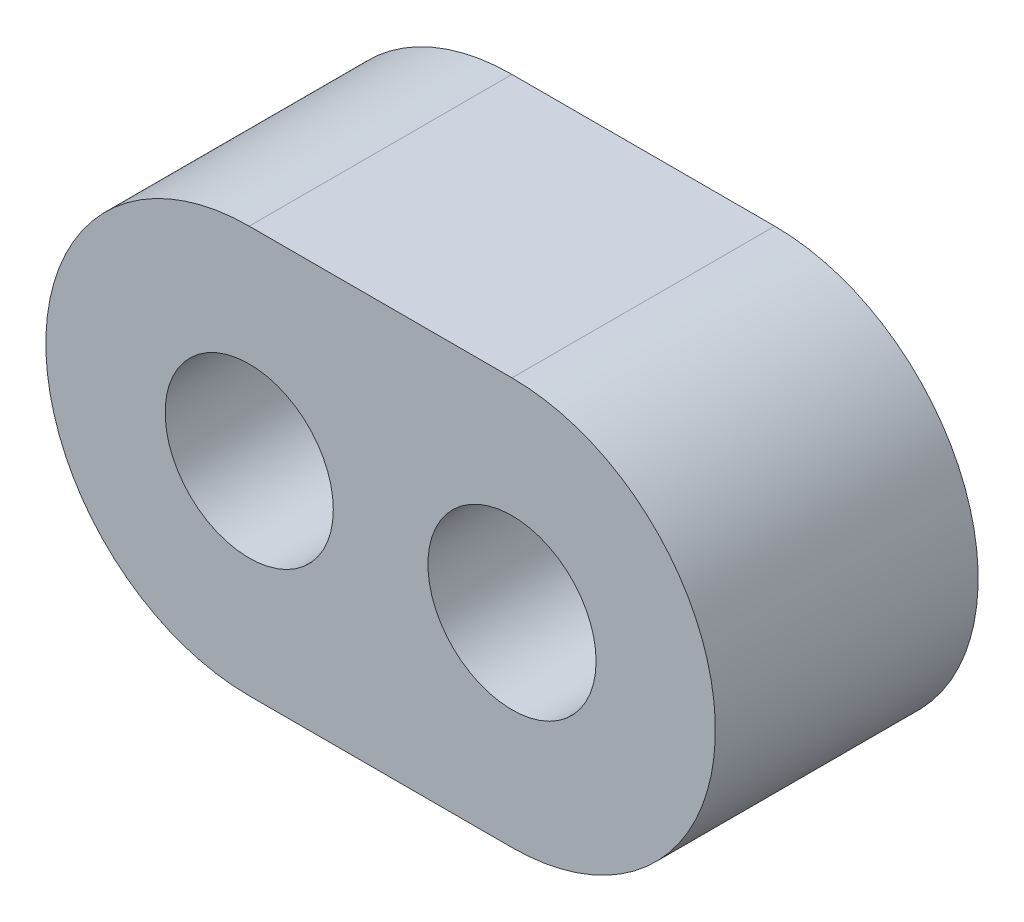
ISO-10303-21;
HEADER;
FILE_DESCRIPTION(('STEP AP214'),'2;1');
FILE_NAME('part.step','',(''),(''),'','','');
FILE_SCHEMA(('AUTOMOTIVE_DESIGN { 1 0 10303 214 1 1 1 1 }'));
ENDSEC;
DATA;
#1=APPLICATION_CONTEXT('core data for automotive mechanical design processes');
#2=APPLICATION_PROTOCOL_DEFINITION('international standard','automotive_design',2000,#1);
#3=PRODUCT_CONTEXT('',#1,'mechanical');
#4=PRODUCT('Part','Part','',(#3));
#5=PRODUCT_RELATED_PRODUCT_CATEGORY('part','',(#4));
#6=PRODUCT_DEFINITION_FORMATION('','',#4);
#7=PRODUCT_DEFINITION_CONTEXT('part definition',#1,'design');
#8=PRODUCT_DEFINITION('design','',#6,#7);
#9=PRODUCT_DEFINITION_SHAPE('','',#8);
#10=(LENGTH_UNIT() NAMED_UNIT(*) SI_UNIT(.MILLI.,.METRE.));
#11=(NAMED_UNIT(*) PLANE_ANGLE_UNIT() SI_UNIT($,.RADIAN.));
#12=(NAMED_UNIT(*) SI_UNIT($,.STERADIAN.) SOLID_ANGLE_UNIT());
#13=UNCERTAINTY_MEASURE_WITH_UNIT(LENGTH_MEASURE(1.E-05),#10,'distance_accuracy_value','');
#14=(GEOMETRIC_REPRESENTATION_CONTEXT(3) GLOBAL_UNCERTAINTY_ASSIGNED_CONTEXT((#13)) GLOBAL_UNIT_ASSIGNED_CONTEXT((#10,
#11,#12)) REPRESENTATION_CONTEXT('',''));
#15=CARTESIAN_POINT('',(0.,0.,0.));
#16=DIRECTION('',(0.,0.,1.));
#17=DIRECTION('',(1.,0.,0.));
#18=AXIS2_PLACEMENT_3D('',#15,#16,#17);
#19=CARTESIAN_POINT('',(0.,0.,5.));
#20=DIRECTION('',(0.,0.,1.));
#21=DIRECTION('',(1.,0.,0.));
#22=AXIS2_PLACEMENT_3D('',#19,#20,#21);
#23=PLANE('',#22);
#24=CARTESIAN_POINT('',(0.,0.,5.));
#25=DIRECTION('',(0.,0.,1.));
#26=DIRECTION('',(1.,0.,0.));
#27=AXIS2_PLACEMENT_3D('',#24,#25,#26);
#28=CIRCLE('',#27,1.6);
#29=CARTESIAN_POINT('',(1.6,0.,5.));
#30=VERTEX_POINT('',#29);
#31=EDGE_CURVE('E102',#30,#30,#28,.T.);
#32=ORIENTED_EDGE('',*,*,#31,.F.);
#33=EDGE_LOOP('',(#32));
#34=FACE_BOUND('',#33,.T.);
#35=CARTESIAN_POINT('',(0.,0.,5.));
#36=DIRECTION('',(0.,0.,1.));
#37=DIRECTION('',(1.,0.,0.));
#38=AXIS2_PLACEMENT_3D('',#35,#36,#37);
#39=CIRCLE('',#38,3.86969976434912);
#40=CARTESIAN_POINT('',(0.,3.86969976434912,5.));
#41=VERTEX_POINT('',#40);
#42=CARTESIAN_POINT('',(0.,-3.86969976434912,5.));
#43=VERTEX_POINT('',#42);
#44=EDGE_CURVE('E87',#41,#43,#39,.T.);
#45=ORIENTED_EDGE('',*,*,#44,.T.);
#46=DIRECTION('',(1.,0.,0.));
#47=VECTOR('',#46,1.);
#48=CARTESIAN_POINT('',(0.,-3.86969976434912,5.));
#49=LINE('',#48,#47);
#50=CARTESIAN_POINT('',(5.,-3.86969976434912,5.));
#51=VERTEX_POINT('',#50);
#52=EDGE_CURVE('E82',#43,#51,#49,.T.);
#53=ORIENTED_EDGE('',*,*,#52,.T.);
#54=CARTESIAN_POINT('',(5.,0.,5.));
#55=DIRECTION('',(0.,0.,1.));
#56=DIRECTION('',(1.,0.,0.));
#57=AXIS2_PLACEMENT_3D('',#54,#55,#56);
#58=CIRCLE('',#57,3.86969976434912);
#59=CARTESIAN_POINT('',(5.,3.86969976434912,5.));
#60=VERTEX_POINT('',#59);
#61=EDGE_CURVE('E85',#51,#60,#58,.T.);
#62=ORIENTED_EDGE('',*,*,#61,.T.);
#63=DIRECTION('',(-1.,0.,0.));
#64=VECTOR('',#63,1.);
#65=CARTESIAN_POINT('',(0.,3.86969976434912,5.));
#66=LINE('',#65,#64);
#67=EDGE_CURVE('E52',#60,#41,#66,.T.);
#68=ORIENTED_EDGE('',*,*,#67,.T.);
#69=EDGE_LOOP('',(#45,#53,#62,#68));
#70=FACE_BOUND('',#69,.T.);
#71=CARTESIAN_POINT('',(5.,0.,5.));
#72=DIRECTION('',(0.,0.,1.));
#73=DIRECTION('',(1.,0.,0.));
#74=AXIS2_PLACEMENT_3D('',#71,#72,#73);
#75=CIRCLE('',#74,1.6);
#76=CARTESIAN_POINT('',(6.6,0.,5.));
#77=VERTEX_POINT('',#76);
#78=EDGE_CURVE('E117',#77,#77,#75,.T.);
#79=ORIENTED_EDGE('',*,*,#78,.F.);
#80=EDGE_LOOP('',(#79));
#81=FACE_BOUND('',#80,.T.);
#82=ADVANCED_FACE('F35',(#34,#70,#81),#23,.T.);
#83=CARTESIAN_POINT('',(0.,0.,0.));
#84=DIRECTION('',(0.,0.,1.));
#85=DIRECTION('',(1.,0.,0.));
#86=AXIS2_PLACEMENT_3D('',#83,#84,#85);
#87=PLANE('',#86);
#88=CARTESIAN_POINT('',(0.,0.,0.));
#89=DIRECTION('',(0.,0.,1.));
#90=DIRECTION('',(1.,0.,0.));
#91=AXIS2_PLACEMENT_3D('',#88,#89,#90);
#92=CIRCLE('',#91,3.86969976434912);
#93=CARTESIAN_POINT('',(0.,3.86969976434912,0.));
#94=VERTEX_POINT('',#93);
#95=CARTESIAN_POINT('',(0.,-3.86969976434912,0.));
#96=VERTEX_POINT('',#95);
#97=EDGE_CURVE('E99',#94,#96,#92,.T.);
#98=ORIENTED_EDGE('',*,*,#97,.F.);
#99=DIRECTION('',(-1.,0.,0.));
#100=VECTOR('',#99,1.);
#101=CARTESIAN_POINT('',(0.,3.86969976434912,0.));
#102=LINE('',#101,#100);
#103=CARTESIAN_POINT('',(5.,3.86969976434912,0.));
#104=VERTEX_POINT('',#103);
#105=EDGE_CURVE('E75',#104,#94,#102,.T.);
#106=ORIENTED_EDGE('',*,*,#105,.F.);
#107=CARTESIAN_POINT('',(5.,0.,0.));
#108=DIRECTION('',(0.,0.,1.));
#109=DIRECTION('',(1.,0.,0.));
#110=AXIS2_PLACEMENT_3D('',#107,#108,#109);
#111=CIRCLE('',#110,3.86969976434912);
#112=CARTESIAN_POINT('',(5.,-3.86969976434912,0.));
#113=VERTEX_POINT('',#112);
#114=EDGE_CURVE('E69',#113,#104,#111,.T.);
#115=ORIENTED_EDGE('',*,*,#114,.F.);
#116=DIRECTION('',(1.,0.,0.));
#117=VECTOR('',#116,1.);
#118=CARTESIAN_POINT('',(0.,-3.86969976434912,0.));
#119=LINE('',#118,#117);
#120=EDGE_CURVE('E91',#96,#113,#119,.T.);
#121=ORIENTED_EDGE('',*,*,#120,.F.);
#122=EDGE_LOOP('',(#98,#106,#115,#121));
#123=FACE_BOUND('',#122,.T.);
#124=CARTESIAN_POINT('',(0.,0.,0.));
#125=DIRECTION('',(0.,0.,1.));
#126=DIRECTION('',(1.,0.,0.));
#127=AXIS2_PLACEMENT_3D('',#124,#125,#126);
#128=CIRCLE('',#127,1.6);
#129=CARTESIAN_POINT('',(1.6,0.,0.));
#130=VERTEX_POINT('',#129);
#131=EDGE_CURVE('E114',#130,#130,#128,.T.);
#132=ORIENTED_EDGE('',*,*,#131,.T.);
#133=EDGE_LOOP('',(#132));
#134=FACE_BOUND('',#133,.T.);
#135=CARTESIAN_POINT('',(5.,0.,0.));
#136=DIRECTION('',(0.,0.,1.));
#137=DIRECTION('',(1.,0.,0.));
#138=AXIS2_PLACEMENT_3D('',#135,#136,#137);
#139=CIRCLE('',#138,1.6);
#140=CARTESIAN_POINT('',(6.6,0.,0.));
#141=VERTEX_POINT('',#140);
#142=EDGE_CURVE('E120',#141,#141,#139,.T.);
#143=ORIENTED_EDGE('',*,*,#142,.T.);
#144=EDGE_LOOP('',(#143));
#145=FACE_BOUND('',#144,.T.);
#146=ADVANCED_FACE('F110',(#123,#134,#145),#87,.F.);
#147=CARTESIAN_POINT('',(0.,0.,5.));
#148=DIRECTION('',(0.,0.,-1.));
#149=DIRECTION('',(-1.,0.,0.));
#150=AXIS2_PLACEMENT_3D('',#147,#148,#149);
#151=CYLINDRICAL_SURFACE('',#150,3.86969976434912);
#152=ORIENTED_EDGE('',*,*,#97,.T.);
#153=DIRECTION('',(0.,0.,-1.));
#154=VECTOR('',#153,1.);
#155=CARTESIAN_POINT('',(0.,-3.86969976434912,5.));
#156=LINE('',#155,#154);
#157=EDGE_CURVE('E11',#43,#96,#156,.T.);
#158=ORIENTED_EDGE('',*,*,#157,.F.);
#159=ORIENTED_EDGE('',*,*,#44,.F.);
#160=DIRECTION('',(0.,0.,-1.));
#161=VECTOR('',#160,1.);
#162=CARTESIAN_POINT('',(0.,3.86969976434912,5.));
#163=LINE('',#162,#161);
#164=EDGE_CURVE('E95',#41,#94,#163,.T.);
#165=ORIENTED_EDGE('',*,*,#164,.T.);
#166=EDGE_LOOP('',(#152,#158,#159,#165));
#167=FACE_BOUND('',#166,.T.);
#168=ADVANCED_FACE('F37',(#167),#151,.T.);
#169=CARTESIAN_POINT('',(0.,-3.86969976434912,5.));
#170=DIRECTION('',(0.,1.,0.));
#171=DIRECTION('',(0.,0.,1.));
#172=AXIS2_PLACEMENT_3D('',#169,#170,#171);
#173=PLANE('',#172);
#174=ORIENTED_EDGE('',*,*,#120,.T.);
#175=DIRECTION('',(0.,0.,-1.));
#176=VECTOR('',#175,1.);
#177=CARTESIAN_POINT('',(5.,-3.86969976434912,5.));
#178=LINE('',#177,#176);
#179=EDGE_CURVE('E44',#51,#113,#178,.T.);
#180=ORIENTED_EDGE('',*,*,#179,.F.);
#181=ORIENTED_EDGE('',*,*,#52,.F.);
#182=ORIENTED_EDGE('',*,*,#157,.T.);
#183=EDGE_LOOP('',(#174,#180,#181,#182));
#184=FACE_BOUND('',#183,.T.);
#185=ADVANCED_FACE('F90',(#184),#173,.F.);
#186=CARTESIAN_POINT('',(5.,0.,5.));
#187=DIRECTION('',(0.,0.,-1.));
#188=DIRECTION('',(-1.,0.,0.));
#189=AXIS2_PLACEMENT_3D('',#186,#187,#188);
#190=CYLINDRICAL_SURFACE('',#189,3.86969976434912);
#191=ORIENTED_EDGE('',*,*,#114,.T.);
#192=DIRECTION('',(0.,0.,-1.));
#193=VECTOR('',#192,1.);
#194=CARTESIAN_POINT('',(5.,3.86969976434912,5.));
#195=LINE('',#194,#193);
#196=EDGE_CURVE('E92',#60,#104,#195,.T.);
#197=ORIENTED_EDGE('',*,*,#196,.F.);
#198=ORIENTED_EDGE('',*,*,#61,.F.);
#199=ORIENTED_EDGE('',*,*,#179,.T.);
#200=EDGE_LOOP('',(#191,#197,#198,#199));
#201=FACE_BOUND('',#200,.T.);
#202=ADVANCED_FACE('F93',(#201),#190,.T.);
#203=CARTESIAN_POINT('',(0.,3.86969976434912,5.));
#204=DIRECTION('',(0.,-1.,0.));
#205=DIRECTION('',(0.,0.,-1.));
#206=AXIS2_PLACEMENT_3D('',#203,#204,#205);
#207=PLANE('',#206);
#208=ORIENTED_EDGE('',*,*,#105,.T.);
#209=ORIENTED_EDGE('',*,*,#164,.F.);
#210=ORIENTED_EDGE('',*,*,#67,.F.);
#211=ORIENTED_EDGE('',*,*,#196,.T.);
#212=EDGE_LOOP('',(#208,#209,#210,#211));
#213=FACE_BOUND('',#212,.T.);
#214=ADVANCED_FACE('F107',(#213),#207,.F.);
#215=CARTESIAN_POINT('',(0.,0.,5.));
#216=DIRECTION('',(0.,0.,-1.));
#217=DIRECTION('',(-1.,0.,0.));
#218=AXIS2_PLACEMENT_3D('',#215,#216,#217);
#219=CYLINDRICAL_SURFACE('',#218,1.6);
#220=ORIENTED_EDGE('',*,*,#31,.T.);
#221=EDGE_LOOP('',(#220));
#222=FACE_BOUND('',#221,.T.);
#223=ORIENTED_EDGE('',*,*,#131,.F.);
#224=EDGE_LOOP('',(#223));
#225=FACE_BOUND('',#224,.T.);
#226=ADVANCED_FACE('F137',(#222,#225),#219,.F.);
#227=CARTESIAN_POINT('',(5.,0.,5.));
#228=DIRECTION('',(0.,0.,-1.));
#229=DIRECTION('',(-1.,0.,0.));
#230=AXIS2_PLACEMENT_3D('',#227,#228,#229);
#231=CYLINDRICAL_SURFACE('',#230,1.6);
#232=ORIENTED_EDGE('',*,*,#78,.T.);
#233=EDGE_LOOP('',(#232));
#234=FACE_BOUND('',#233,.T.);
#235=ORIENTED_EDGE('',*,*,#142,.F.);
#236=EDGE_LOOP('',(#235));
#237=FACE_BOUND('',#236,.T.);
#238=ADVANCED_FACE('F126',(#234,#237),#231,.F.);
#239=CLOSED_SHELL('',(#82,#146,#168,#185,#202,#214,#226,#238));
#240=MANIFOLD_SOLID_BREP('B2',#239);
#241=ADVANCED_BREP_SHAPE_REPRESENTATION('',(#18,#240),#14);
#242=SHAPE_DEFINITION_REPRESENTATION(#9,#241);
ENDSEC;
END-ISO-10303-21;
